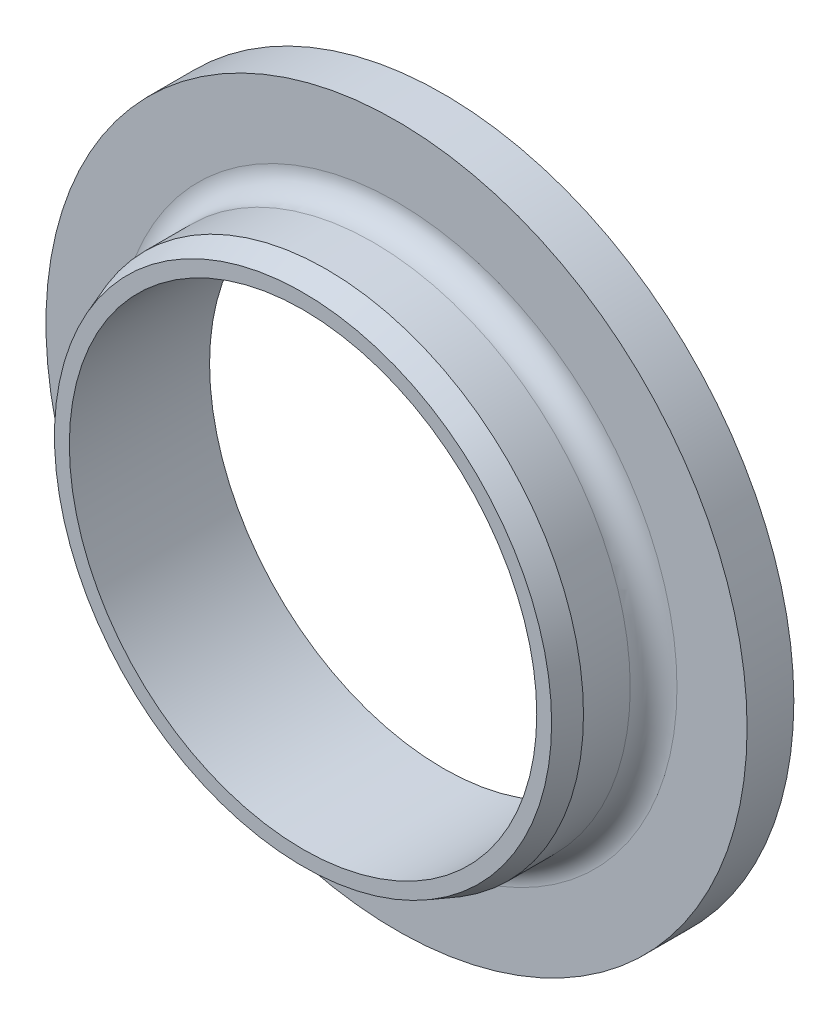
ISO-10303-21;
HEADER;
FILE_DESCRIPTION(('STEP AP214'),'2;1');
FILE_NAME('part.step','',(''),(''),'','','');
FILE_SCHEMA(('AUTOMOTIVE_DESIGN { 1 0 10303 214 1 1 1 1 }'));
ENDSEC;
DATA;
#1=APPLICATION_CONTEXT('core data for automotive mechanical design processes');
#2=APPLICATION_PROTOCOL_DEFINITION('international standard','automotive_design',2000,#1);
#3=PRODUCT_CONTEXT('',#1,'mechanical');
#4=PRODUCT('Part','Part','',(#3));
#5=PRODUCT_RELATED_PRODUCT_CATEGORY('part','',(#4));
#6=PRODUCT_DEFINITION_FORMATION('','',#4);
#7=PRODUCT_DEFINITION_CONTEXT('part definition',#1,'design');
#8=PRODUCT_DEFINITION('design','',#6,#7);
#9=PRODUCT_DEFINITION_SHAPE('','',#8);
#10=(LENGTH_UNIT() NAMED_UNIT(*) SI_UNIT(.MILLI.,.METRE.));
#11=(NAMED_UNIT(*) PLANE_ANGLE_UNIT() SI_UNIT($,.RADIAN.));
#12=(NAMED_UNIT(*) SI_UNIT($,.STERADIAN.) SOLID_ANGLE_UNIT());
#13=UNCERTAINTY_MEASURE_WITH_UNIT(LENGTH_MEASURE(1.E-05),#10,'distance_accuracy_value','');
#14=(GEOMETRIC_REPRESENTATION_CONTEXT(3) GLOBAL_UNCERTAINTY_ASSIGNED_CONTEXT((#13)) GLOBAL_UNIT_ASSIGNED_CONTEXT((#10,
#11,#12)) REPRESENTATION_CONTEXT('',''));
#15=CARTESIAN_POINT('',(0.,0.,0.));
#16=DIRECTION('',(0.,0.,1.));
#17=DIRECTION('',(1.,0.,0.));
#18=AXIS2_PLACEMENT_3D('',#15,#16,#17);
#19=CARTESIAN_POINT('',(0.,0.,3.));
#20=DIRECTION('',(0.,0.,-1.));
#21=DIRECTION('',(-1.,0.,0.));
#22=AXIS2_PLACEMENT_3D('',#19,#20,#21);
#23=CONICAL_SURFACE('',#22,5.31801488290284,0.34906585036886);
#24=CARTESIAN_POINT('',(0.,0.,2.49999999994088));
#25=DIRECTION('',(0.,0.,1.));
#26=DIRECTION('',(1.,0.,0.));
#27=AXIS2_PLACEMENT_3D('',#24,#25,#26);
#28=CIRCLE('',#27,5.50000000004047);
#29=CARTESIAN_POINT('',(5.50000000004047,0.,2.49999999994088));
#30=VERTEX_POINT('',#29);
#31=EDGE_CURVE('E59',#30,#30,#28,.T.);
#32=ORIENTED_EDGE('',*,*,#31,.T.);
#33=EDGE_LOOP('',(#32));
#34=FACE_BOUND('',#33,.T.);
#35=CARTESIAN_POINT('',(0.,0.,3.));
#36=DIRECTION('',(0.,0.,1.));
#37=DIRECTION('',(1.,0.,0.));
#38=AXIS2_PLACEMENT_3D('',#35,#36,#37);
#39=CIRCLE('',#38,5.31801488290284);
#40=CARTESIAN_POINT('',(5.31801488290284,0.,3.));
#41=VERTEX_POINT('',#40);
#42=EDGE_CURVE('E10',#41,#41,#39,.T.);
#43=ORIENTED_EDGE('',*,*,#42,.F.);
#44=EDGE_LOOP('',(#43));
#45=FACE_BOUND('',#44,.T.);
#46=ADVANCED_FACE('F31',(#34,#45),#23,.T.);
#47=CARTESIAN_POINT('',(5.,0.,3.));
#48=DIRECTION('',(0.,0.,1.));
#49=DIRECTION('',(1.,0.,0.));
#50=AXIS2_PLACEMENT_3D('',#47,#48,#49);
#51=PLANE('',#50);
#52=ORIENTED_EDGE('',*,*,#42,.T.);
#53=EDGE_LOOP('',(#52));
#54=FACE_BOUND('',#53,.T.);
#55=CARTESIAN_POINT('',(0.,0.,3.));
#56=DIRECTION('',(0.,0.,1.));
#57=DIRECTION('',(1.,0.,0.));
#58=AXIS2_PLACEMENT_3D('',#55,#56,#57);
#59=CIRCLE('',#58,5.);
#60=CARTESIAN_POINT('',(5.,0.,3.));
#61=VERTEX_POINT('',#60);
#62=EDGE_CURVE('E37',#61,#61,#59,.T.);
#63=ORIENTED_EDGE('',*,*,#62,.F.);
#64=EDGE_LOOP('',(#63));
#65=FACE_BOUND('',#64,.T.);
#66=ADVANCED_FACE('F77',(#54,#65),#51,.T.);
#67=CARTESIAN_POINT('',(0.,0.,0.));
#68=DIRECTION('',(0.,0.,1.));
#69=DIRECTION('',(1.,0.,0.));
#70=AXIS2_PLACEMENT_3D('',#67,#68,#69);
#71=CYLINDRICAL_SURFACE('',#70,5.);
#72=ORIENTED_EDGE('',*,*,#62,.T.);
#73=EDGE_LOOP('',(#72));
#74=FACE_BOUND('',#73,.T.);
#75=CARTESIAN_POINT('',(0.,0.,0.));
#76=DIRECTION('',(0.,0.,1.));
#77=DIRECTION('',(1.,0.,0.));
#78=AXIS2_PLACEMENT_3D('',#75,#76,#77);
#79=CIRCLE('',#78,5.);
#80=CARTESIAN_POINT('',(5.,0.,0.));
#81=VERTEX_POINT('',#80);
#82=EDGE_CURVE('E41',#81,#81,#79,.T.);
#83=ORIENTED_EDGE('',*,*,#82,.F.);
#84=EDGE_LOOP('',(#83));
#85=FACE_BOUND('',#84,.T.);
#86=ADVANCED_FACE('F81',(#74,#85),#71,.F.);
#87=CARTESIAN_POINT('',(7.50000000004047,0.,0.));
#88=DIRECTION('',(0.,0.,-1.));
#89=DIRECTION('',(-1.,0.,0.));
#90=AXIS2_PLACEMENT_3D('',#87,#88,#89);
#91=PLANE('',#90);
#92=ORIENTED_EDGE('',*,*,#82,.T.);
#93=EDGE_LOOP('',(#92));
#94=FACE_BOUND('',#93,.T.);
#95=CARTESIAN_POINT('',(0.,0.,0.));
#96=DIRECTION('',(0.,0.,1.));
#97=DIRECTION('',(1.,0.,0.));
#98=AXIS2_PLACEMENT_3D('',#95,#96,#97);
#99=CIRCLE('',#98,7.50000000004047);
#100=CARTESIAN_POINT('',(7.50000000004047,0.,0.));
#101=VERTEX_POINT('',#100);
#102=EDGE_CURVE('E45',#101,#101,#99,.T.);
#103=ORIENTED_EDGE('',*,*,#102,.F.);
#104=EDGE_LOOP('',(#103));
#105=FACE_BOUND('',#104,.T.);
#106=ADVANCED_FACE('F85',(#94,#105),#91,.T.);
#107=CARTESIAN_POINT('',(0.,0.,0.));
#108=DIRECTION('',(0.,0.,1.));
#109=DIRECTION('',(1.,0.,0.));
#110=AXIS2_PLACEMENT_3D('',#107,#108,#109);
#111=CYLINDRICAL_SURFACE('',#110,7.50000000004047);
#112=ORIENTED_EDGE('',*,*,#102,.T.);
#113=EDGE_LOOP('',(#112));
#114=FACE_BOUND('',#113,.T.);
#115=CARTESIAN_POINT('',(0.,0.,0.999999999999999));
#116=DIRECTION('',(0.,0.,1.));
#117=DIRECTION('',(1.,0.,0.));
#118=AXIS2_PLACEMENT_3D('',#115,#116,#117);
#119=CIRCLE('',#118,7.50000000004047);
#120=CARTESIAN_POINT('',(7.50000000004047,0.,0.999999999999999));
#121=VERTEX_POINT('',#120);
#122=EDGE_CURVE('E50',#121,#121,#119,.T.);
#123=ORIENTED_EDGE('',*,*,#122,.F.);
#124=EDGE_LOOP('',(#123));
#125=FACE_BOUND('',#124,.T.);
#126=ADVANCED_FACE('F91',(#114,#125),#111,.T.);
#127=CARTESIAN_POINT('',(6.00000000004047,0.,0.999999999999999));
#128=DIRECTION('',(0.,0.,1.));
#129=DIRECTION('',(1.,0.,0.));
#130=AXIS2_PLACEMENT_3D('',#127,#128,#129);
#131=PLANE('',#130);
#132=ORIENTED_EDGE('',*,*,#122,.T.);
#133=EDGE_LOOP('',(#132));
#134=FACE_BOUND('',#133,.T.);
#135=CARTESIAN_POINT('',(0.,0.,0.999999999999999));
#136=DIRECTION('',(0.,0.,1.));
#137=DIRECTION('',(1.,0.,0.));
#138=AXIS2_PLACEMENT_3D('',#135,#136,#137);
#139=CIRCLE('',#138,6.00000000004047);
#140=CARTESIAN_POINT('',(6.00000000004047,0.,0.999999999999999));
#141=VERTEX_POINT('',#140);
#142=EDGE_CURVE('E53',#141,#141,#139,.T.);
#143=ORIENTED_EDGE('',*,*,#142,.F.);
#144=EDGE_LOOP('',(#143));
#145=FACE_BOUND('',#144,.T.);
#146=ADVANCED_FACE('F73',(#134,#145),#131,.T.);
#147=CARTESIAN_POINT('',(0.,0.,1.5));
#148=DIRECTION('',(0.,0.,1.));
#149=DIRECTION('',(1.,0.,0.));
#150=AXIS2_PLACEMENT_3D('',#147,#148,#149);
#151=TOROIDAL_SURFACE('',#150,6.00000000004047,0.500000000000001);
#152=ORIENTED_EDGE('',*,*,#142,.T.);
#153=EDGE_LOOP('',(#152));
#154=FACE_BOUND('',#153,.T.);
#155=CARTESIAN_POINT('',(0.,0.,1.5));
#156=DIRECTION('',(0.,0.,1.));
#157=DIRECTION('',(1.,0.,0.));
#158=AXIS2_PLACEMENT_3D('',#155,#156,#157);
#159=CIRCLE('',#158,5.50000000004047);
#160=CARTESIAN_POINT('',(5.50000000004047,0.,1.5));
#161=VERTEX_POINT('',#160);
#162=EDGE_CURVE('E56',#161,#161,#159,.T.);
#163=ORIENTED_EDGE('',*,*,#162,.F.);
#164=EDGE_LOOP('',(#163));
#165=FACE_BOUND('',#164,.T.);
#166=ADVANCED_FACE('F67',(#154,#165),#151,.F.);
#167=CARTESIAN_POINT('',(0.,0.,0.));
#168=DIRECTION('',(0.,0.,1.));
#169=DIRECTION('',(1.,0.,0.));
#170=AXIS2_PLACEMENT_3D('',#167,#168,#169);
#171=CYLINDRICAL_SURFACE('',#170,5.50000000004047);
#172=ORIENTED_EDGE('',*,*,#162,.T.);
#173=EDGE_LOOP('',(#172));
#174=FACE_BOUND('',#173,.T.);
#175=ORIENTED_EDGE('',*,*,#31,.F.);
#176=EDGE_LOOP('',(#175));
#177=FACE_BOUND('',#176,.T.);
#178=ADVANCED_FACE('F65',(#174,#177),#171,.T.);
#179=CLOSED_SHELL('',(#46,#66,#86,#106,#126,#146,#166,#178));
#180=MANIFOLD_SOLID_BREP('B2',#179);
#181=ADVANCED_BREP_SHAPE_REPRESENTATION('',(#18,#180),#14);
#182=SHAPE_DEFINITION_REPRESENTATION(#9,#181);
ENDSEC;
END-ISO-10303-21;
